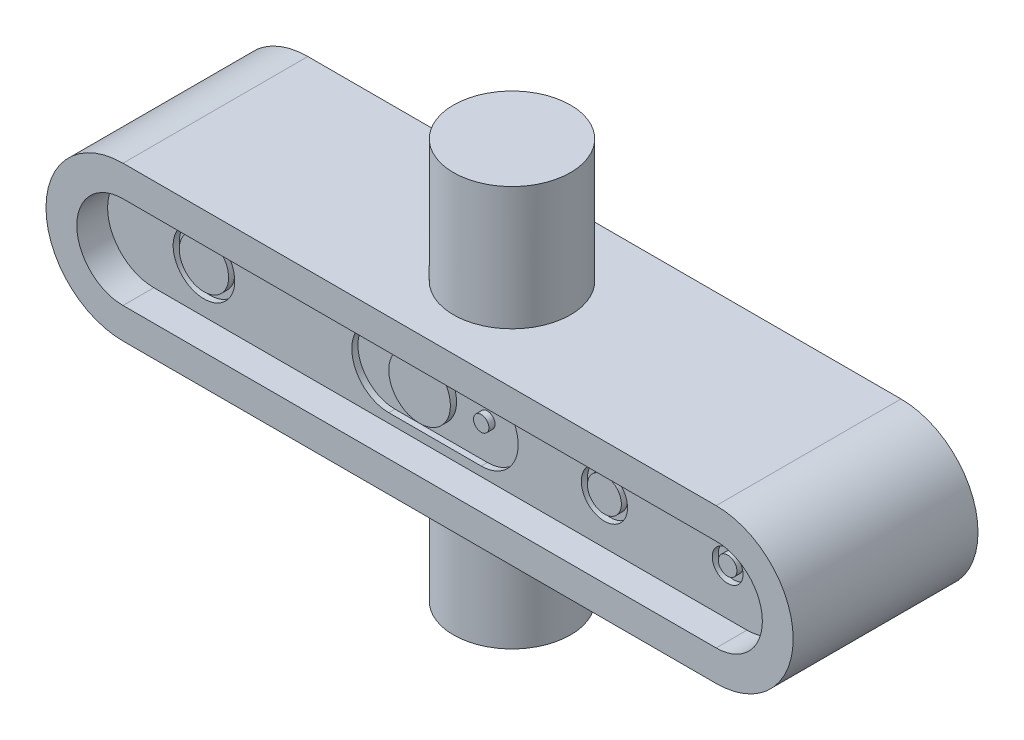
ISO-10303-21;
HEADER;
FILE_DESCRIPTION(('STEP AP214'),'2;1');
FILE_NAME('part.step','',(''),(''),'','','');
FILE_SCHEMA(('AUTOMOTIVE_DESIGN { 1 0 10303 214 1 1 1 1 }'));
ENDSEC;
DATA;
#1=APPLICATION_CONTEXT('core data for automotive mechanical design processes');
#2=APPLICATION_PROTOCOL_DEFINITION('international standard','automotive_design',2000,#1);
#3=PRODUCT_CONTEXT('',#1,'mechanical');
#4=PRODUCT('Part','Part','',(#3));
#5=PRODUCT_RELATED_PRODUCT_CATEGORY('part','',(#4));
#6=PRODUCT_DEFINITION_FORMATION('','',#4);
#7=PRODUCT_DEFINITION_CONTEXT('part definition',#1,'design');
#8=PRODUCT_DEFINITION('design','',#6,#7);
#9=PRODUCT_DEFINITION_SHAPE('','',#8);
#10=(LENGTH_UNIT() NAMED_UNIT(*) SI_UNIT(.MILLI.,.METRE.));
#11=(NAMED_UNIT(*) PLANE_ANGLE_UNIT() SI_UNIT($,.RADIAN.));
#12=(NAMED_UNIT(*) SI_UNIT($,.STERADIAN.) SOLID_ANGLE_UNIT());
#13=UNCERTAINTY_MEASURE_WITH_UNIT(LENGTH_MEASURE(1.E-05),#10,'distance_accuracy_value','');
#14=(GEOMETRIC_REPRESENTATION_CONTEXT(3) GLOBAL_UNCERTAINTY_ASSIGNED_CONTEXT((#13)) GLOBAL_UNIT_ASSIGNED_CONTEXT((#10,
#11,#12)) REPRESENTATION_CONTEXT('',''));
#15=CARTESIAN_POINT('',(0.,0.,0.));
#16=DIRECTION('',(0.,0.,1.));
#17=DIRECTION('',(1.,0.,0.));
#18=AXIS2_PLACEMENT_3D('',#15,#16,#17);
#19=CARTESIAN_POINT('',(-48.1360940201584,0.,25.));
#20=DIRECTION('',(0.,0.,-1.));
#21=DIRECTION('',(-1.,0.,0.));
#22=AXIS2_PLACEMENT_3D('',#19,#20,#21);
#23=CYLINDRICAL_SURFACE('',#22,12.5);
#24=CARTESIAN_POINT('',(-48.1360940201584,0.,0.));
#25=DIRECTION('',(0.,0.,1.));
#26=DIRECTION('',(1.,0.,0.));
#27=AXIS2_PLACEMENT_3D('',#24,#25,#26);
#28=CIRCLE('',#27,12.5);
#29=CARTESIAN_POINT('',(-48.1360940201584,12.5,0.));
#30=VERTEX_POINT('',#29);
#31=CARTESIAN_POINT('',(-48.1360940201584,-12.5,0.));
#32=VERTEX_POINT('',#31);
#33=EDGE_CURVE('E247',#30,#32,#28,.T.);
#34=ORIENTED_EDGE('',*,*,#33,.T.);
#35=DIRECTION('',(0.,0.,-1.));
#36=VECTOR('',#35,1.);
#37=CARTESIAN_POINT('',(-48.1360940201584,-12.5,25.));
#38=LINE('',#37,#36);
#39=CARTESIAN_POINT('',(-48.1360940201584,-12.5,30.));
#40=VERTEX_POINT('',#39);
#41=EDGE_CURVE('E265',#40,#32,#38,.T.);
#42=ORIENTED_EDGE('',*,*,#41,.F.);
#43=CARTESIAN_POINT('',(-48.1360940201584,0.,30.));
#44=DIRECTION('',(0.,0.,1.));
#45=DIRECTION('',(1.,0.,0.));
#46=AXIS2_PLACEMENT_3D('',#43,#44,#45);
#47=CIRCLE('',#46,12.5);
#48=CARTESIAN_POINT('',(-48.1360940201584,12.5,30.));
#49=VERTEX_POINT('',#48);
#50=EDGE_CURVE('E205',#49,#40,#47,.T.);
#51=ORIENTED_EDGE('',*,*,#50,.F.);
#52=DIRECTION('',(0.,0.,-1.));
#53=VECTOR('',#52,1.);
#54=CARTESIAN_POINT('',(-48.1360940201584,12.5,25.));
#55=LINE('',#54,#53);
#56=EDGE_CURVE('E256',#49,#30,#55,.T.);
#57=ORIENTED_EDGE('',*,*,#56,.T.);
#58=EDGE_LOOP('',(#34,#42,#51,#57));
#59=FACE_BOUND('',#58,.T.);
#60=ADVANCED_FACE('F73',(#59),#23,.T.);
#61=CARTESIAN_POINT('',(48.1360940201584,-12.5,25.));
#62=DIRECTION('',(0.,1.,0.));
#63=DIRECTION('',(0.,0.,1.));
#64=AXIS2_PLACEMENT_3D('',#61,#62,#63);
#65=PLANE('',#64);
#66=CARTESIAN_POINT('',(0.,-12.5,15.));
#67=DIRECTION('',(0.,1.,0.));
#68=DIRECTION('',(0.,0.,1.));
#69=AXIS2_PLACEMENT_3D('',#66,#67,#68);
#70=CIRCLE('',#69,9.5);
#71=CARTESIAN_POINT('',(0.,-12.5,24.5));
#72=VERTEX_POINT('',#71);
#73=EDGE_CURVE('E12',#72,#72,#70,.F.);
#74=ORIENTED_EDGE('',*,*,#73,.F.);
#75=EDGE_LOOP('',(#74));
#76=FACE_BOUND('',#75,.T.);
#77=DIRECTION('',(1.,0.,0.));
#78=VECTOR('',#77,1.);
#79=CARTESIAN_POINT('',(48.1360940201584,-12.5,0.));
#80=LINE('',#79,#78);
#81=CARTESIAN_POINT('',(48.1360940201584,-12.5,0.));
#82=VERTEX_POINT('',#81);
#83=EDGE_CURVE('E250',#32,#82,#80,.T.);
#84=ORIENTED_EDGE('',*,*,#83,.T.);
#85=DIRECTION('',(0.,0.,-1.));
#86=VECTOR('',#85,1.);
#87=CARTESIAN_POINT('',(48.1360940201584,-12.5,25.));
#88=LINE('',#87,#86);
#89=CARTESIAN_POINT('',(48.1360940201584,-12.5,30.));
#90=VERTEX_POINT('',#89);
#91=EDGE_CURVE('E262',#90,#82,#88,.T.);
#92=ORIENTED_EDGE('',*,*,#91,.F.);
#93=DIRECTION('',(1.,0.,0.));
#94=VECTOR('',#93,1.);
#95=CARTESIAN_POINT('',(-48.1360940201584,-12.5,30.));
#96=LINE('',#95,#94);
#97=EDGE_CURVE('E227',#40,#90,#96,.T.);
#98=ORIENTED_EDGE('',*,*,#97,.F.);
#99=ORIENTED_EDGE('',*,*,#41,.T.);
#100=EDGE_LOOP('',(#84,#92,#98,#99));
#101=FACE_BOUND('',#100,.T.);
#102=ADVANCED_FACE('F287',(#76,#101),#65,.F.);
#103=CARTESIAN_POINT('',(48.1360940201584,0.,25.));
#104=DIRECTION('',(0.,0.,-1.));
#105=DIRECTION('',(-1.,0.,0.));
#106=AXIS2_PLACEMENT_3D('',#103,#104,#105);
#107=CYLINDRICAL_SURFACE('',#106,12.5);
#108=CARTESIAN_POINT('',(48.1360940201584,0.,0.));
#109=DIRECTION('',(0.,0.,1.));
#110=DIRECTION('',(-1.,0.,0.));
#111=AXIS2_PLACEMENT_3D('',#108,#109,#110);
#112=CIRCLE('',#111,12.5);
#113=CARTESIAN_POINT('',(48.1360940201584,12.5,0.));
#114=VERTEX_POINT('',#113);
#115=EDGE_CURVE('E252',#82,#114,#112,.T.);
#116=ORIENTED_EDGE('',*,*,#115,.T.);
#117=DIRECTION('',(0.,0.,-1.));
#118=VECTOR('',#117,1.);
#119=CARTESIAN_POINT('',(48.1360940201584,12.5,25.));
#120=LINE('',#119,#118);
#121=CARTESIAN_POINT('',(48.1360940201584,12.5,30.));
#122=VERTEX_POINT('',#121);
#123=EDGE_CURVE('E259',#122,#114,#120,.T.);
#124=ORIENTED_EDGE('',*,*,#123,.F.);
#125=CARTESIAN_POINT('',(48.1360940201584,0.,30.));
#126=DIRECTION('',(0.,0.,1.));
#127=DIRECTION('',(1.,0.,0.));
#128=AXIS2_PLACEMENT_3D('',#125,#126,#127);
#129=CIRCLE('',#128,12.5);
#130=EDGE_CURVE('E230',#90,#122,#129,.T.);
#131=ORIENTED_EDGE('',*,*,#130,.F.);
#132=ORIENTED_EDGE('',*,*,#91,.T.);
#133=EDGE_LOOP('',(#116,#124,#131,#132));
#134=FACE_BOUND('',#133,.T.);
#135=ADVANCED_FACE('F276',(#134),#107,.T.);
#136=CARTESIAN_POINT('',(-48.1360940201584,12.5,25.));
#137=DIRECTION('',(0.,-1.,0.));
#138=DIRECTION('',(0.,0.,-1.));
#139=AXIS2_PLACEMENT_3D('',#136,#137,#138);
#140=PLANE('',#139);
#141=CARTESIAN_POINT('',(0.,12.5,15.));
#142=DIRECTION('',(0.,-1.,0.));
#143=DIRECTION('',(0.,0.,-1.));
#144=AXIS2_PLACEMENT_3D('',#141,#142,#143);
#145=CIRCLE('',#144,9.5);
#146=CARTESIAN_POINT('',(0.,12.5,5.50000000000001));
#147=VERTEX_POINT('',#146);
#148=EDGE_CURVE('E80',#147,#147,#145,.F.);
#149=ORIENTED_EDGE('',*,*,#148,.F.);
#150=EDGE_LOOP('',(#149));
#151=FACE_BOUND('',#150,.T.);
#152=DIRECTION('',(-1.,0.,0.));
#153=VECTOR('',#152,1.);
#154=CARTESIAN_POINT('',(-48.1360940201584,12.5,0.));
#155=LINE('',#154,#153);
#156=EDGE_CURVE('E254',#114,#30,#155,.T.);
#157=ORIENTED_EDGE('',*,*,#156,.T.);
#158=ORIENTED_EDGE('',*,*,#56,.F.);
#159=DIRECTION('',(-1.,0.,0.));
#160=VECTOR('',#159,1.);
#161=CARTESIAN_POINT('',(-48.1360940201584,12.5,30.));
#162=LINE('',#161,#160);
#163=EDGE_CURVE('E214',#122,#49,#162,.T.);
#164=ORIENTED_EDGE('',*,*,#163,.F.);
#165=ORIENTED_EDGE('',*,*,#123,.T.);
#166=EDGE_LOOP('',(#157,#158,#164,#165));
#167=FACE_BOUND('',#166,.T.);
#168=ADVANCED_FACE('F272',(#151,#167),#140,.F.);
#169=CARTESIAN_POINT('',(-48.1360940201584,0.,0.));
#170=DIRECTION('',(0.,0.,1.));
#171=DIRECTION('',(1.,0.,0.));
#172=AXIS2_PLACEMENT_3D('',#169,#170,#171);
#173=PLANE('',#172);
#174=ORIENTED_EDGE('',*,*,#33,.F.);
#175=ORIENTED_EDGE('',*,*,#156,.F.);
#176=ORIENTED_EDGE('',*,*,#115,.F.);
#177=ORIENTED_EDGE('',*,*,#83,.F.);
#178=EDGE_LOOP('',(#174,#175,#176,#177));
#179=FACE_BOUND('',#178,.T.);
#180=ADVANCED_FACE('F275',(#179),#173,.F.);
#181=CARTESIAN_POINT('',(-48.1360940201584,7.5,30.));
#182=DIRECTION('',(0.,-1.,0.));
#183=DIRECTION('',(0.,0.,-1.));
#184=AXIS2_PLACEMENT_3D('',#181,#182,#183);
#185=PLANE('',#184);
#186=DIRECTION('',(1.,0.,0.));
#187=VECTOR('',#186,1.);
#188=CARTESIAN_POINT('',(-48.1360940201584,7.5,25.));
#189=LINE('',#188,#187);
#190=CARTESIAN_POINT('',(48.1360940201584,7.5,25.));
#191=VERTEX_POINT('',#190);
#192=CARTESIAN_POINT('',(-48.1360940201584,7.5,25.));
#193=VERTEX_POINT('',#192);
#194=EDGE_CURVE('E211',#191,#193,#189,.F.);
#195=ORIENTED_EDGE('',*,*,#194,.F.);
#196=DIRECTION('',(0.,0.,-1.));
#197=VECTOR('',#196,1.);
#198=CARTESIAN_POINT('',(48.1360940201584,7.5,30.));
#199=LINE('',#198,#197);
#200=CARTESIAN_POINT('',(48.1360940201584,7.5,30.));
#201=VERTEX_POINT('',#200);
#202=EDGE_CURVE('E242',#201,#191,#199,.T.);
#203=ORIENTED_EDGE('',*,*,#202,.F.);
#204=DIRECTION('',(1.,0.,0.));
#205=VECTOR('',#204,1.);
#206=CARTESIAN_POINT('',(-48.1360940201584,7.5,30.));
#207=LINE('',#206,#205);
#208=CARTESIAN_POINT('',(-48.1360940201584,7.5,30.));
#209=VERTEX_POINT('',#208);
#210=EDGE_CURVE('E217',#201,#209,#207,.F.);
#211=ORIENTED_EDGE('',*,*,#210,.T.);
#212=DIRECTION('',(0.,0.,-1.));
#213=VECTOR('',#212,1.);
#214=CARTESIAN_POINT('',(-48.1360940201584,7.5,30.));
#215=LINE('',#214,#213);
#216=EDGE_CURVE('E244',#209,#193,#215,.T.);
#217=ORIENTED_EDGE('',*,*,#216,.T.);
#218=EDGE_LOOP('',(#195,#203,#211,#217));
#219=FACE_BOUND('',#218,.T.);
#220=ADVANCED_FACE('F438',(#219),#185,.T.);
#221=CARTESIAN_POINT('',(48.1360940201584,0.,30.));
#222=DIRECTION('',(0.,0.,-1.));
#223=DIRECTION('',(-1.,0.,0.));
#224=AXIS2_PLACEMENT_3D('',#221,#222,#223);
#225=CYLINDRICAL_SURFACE('',#224,7.5);
#226=CARTESIAN_POINT('',(48.1360940201584,0.,25.));
#227=DIRECTION('',(0.,0.,1.));
#228=DIRECTION('',(1.,0.,0.));
#229=AXIS2_PLACEMENT_3D('',#226,#227,#228);
#230=CIRCLE('',#229,7.5);
#231=CARTESIAN_POINT('',(48.1360940201584,-7.5,25.));
#232=VERTEX_POINT('',#231);
#233=EDGE_CURVE('E95',#232,#191,#230,.T.);
#234=ORIENTED_EDGE('',*,*,#233,.F.);
#235=DIRECTION('',(0.,0.,-1.));
#236=VECTOR('',#235,1.);
#237=CARTESIAN_POINT('',(48.1360940201584,-7.5,30.));
#238=LINE('',#237,#236);
#239=CARTESIAN_POINT('',(48.1360940201584,-7.5,30.));
#240=VERTEX_POINT('',#239);
#241=EDGE_CURVE('E239',#240,#232,#238,.T.);
#242=ORIENTED_EDGE('',*,*,#241,.F.);
#243=CARTESIAN_POINT('',(48.1360940201584,0.,30.));
#244=DIRECTION('',(0.,0.,1.));
#245=DIRECTION('',(1.,0.,0.));
#246=AXIS2_PLACEMENT_3D('',#243,#244,#245);
#247=CIRCLE('',#246,7.5);
#248=EDGE_CURVE('E221',#240,#201,#247,.T.);
#249=ORIENTED_EDGE('',*,*,#248,.T.);
#250=ORIENTED_EDGE('',*,*,#202,.T.);
#251=EDGE_LOOP('',(#234,#242,#249,#250));
#252=FACE_BOUND('',#251,.T.);
#253=ADVANCED_FACE('F434',(#252),#225,.F.);
#254=CARTESIAN_POINT('',(-48.1360940201584,-7.5,30.));
#255=DIRECTION('',(0.,1.,0.));
#256=DIRECTION('',(0.,0.,1.));
#257=AXIS2_PLACEMENT_3D('',#254,#255,#256);
#258=PLANE('',#257);
#259=DIRECTION('',(1.,0.,0.));
#260=VECTOR('',#259,1.);
#261=CARTESIAN_POINT('',(-48.1360940201584,-7.5,25.));
#262=LINE('',#261,#260);
#263=CARTESIAN_POINT('',(-48.1360940201584,-7.5,25.));
#264=VERTEX_POINT('',#263);
#265=EDGE_CURVE('E218',#264,#232,#262,.T.);
#266=ORIENTED_EDGE('',*,*,#265,.F.);
#267=DIRECTION('',(0.,0.,-1.));
#268=VECTOR('',#267,1.);
#269=CARTESIAN_POINT('',(-48.1360940201584,-7.5,30.));
#270=LINE('',#269,#268);
#271=CARTESIAN_POINT('',(-48.1360940201584,-7.5,30.));
#272=VERTEX_POINT('',#271);
#273=EDGE_CURVE('E233',#272,#264,#270,.T.);
#274=ORIENTED_EDGE('',*,*,#273,.F.);
#275=DIRECTION('',(1.,0.,0.));
#276=VECTOR('',#275,1.);
#277=CARTESIAN_POINT('',(-48.1360940201584,-7.5,30.));
#278=LINE('',#277,#276);
#279=EDGE_CURVE('E224',#272,#240,#278,.T.);
#280=ORIENTED_EDGE('',*,*,#279,.T.);
#281=ORIENTED_EDGE('',*,*,#241,.T.);
#282=EDGE_LOOP('',(#266,#274,#280,#281));
#283=FACE_BOUND('',#282,.T.);
#284=ADVANCED_FACE('F430',(#283),#258,.T.);
#285=CARTESIAN_POINT('',(48.1360940201584,0.,30.));
#286=DIRECTION('',(0.,0.,1.));
#287=DIRECTION('',(1.,0.,0.));
#288=AXIS2_PLACEMENT_3D('',#285,#286,#287);
#289=PLANE('',#288);
#290=ORIENTED_EDGE('',*,*,#279,.F.);
#291=CARTESIAN_POINT('',(-48.1360940201584,0.,30.));
#292=DIRECTION('',(0.,0.,1.));
#293=DIRECTION('',(1.,0.,0.));
#294=AXIS2_PLACEMENT_3D('',#291,#292,#293);
#295=CIRCLE('',#294,7.5);
#296=EDGE_CURVE('E208',#209,#272,#295,.T.);
#297=ORIENTED_EDGE('',*,*,#296,.F.);
#298=ORIENTED_EDGE('',*,*,#210,.F.);
#299=ORIENTED_EDGE('',*,*,#248,.F.);
#300=EDGE_LOOP('',(#290,#297,#298,#299));
#301=FACE_BOUND('',#300,.T.);
#302=ORIENTED_EDGE('',*,*,#163,.T.);
#303=ORIENTED_EDGE('',*,*,#50,.T.);
#304=ORIENTED_EDGE('',*,*,#97,.T.);
#305=ORIENTED_EDGE('',*,*,#130,.T.);
#306=EDGE_LOOP('',(#302,#303,#304,#305));
#307=FACE_BOUND('',#306,.T.);
#308=ADVANCED_FACE('F289',(#301,#307),#289,.T.);
#309=CARTESIAN_POINT('',(-48.1360940201584,0.,30.));
#310=DIRECTION('',(0.,0.,-1.));
#311=DIRECTION('',(-1.,0.,0.));
#312=AXIS2_PLACEMENT_3D('',#309,#310,#311);
#313=CYLINDRICAL_SURFACE('',#312,7.5);
#314=CARTESIAN_POINT('',(-48.1360940201584,0.,25.));
#315=DIRECTION('',(0.,0.,1.));
#316=DIRECTION('',(1.,0.,0.));
#317=AXIS2_PLACEMENT_3D('',#314,#315,#316);
#318=CIRCLE('',#317,7.5);
#319=EDGE_CURVE('E209',#193,#264,#318,.T.);
#320=ORIENTED_EDGE('',*,*,#319,.F.);
#321=ORIENTED_EDGE('',*,*,#216,.F.);
#322=ORIENTED_EDGE('',*,*,#296,.T.);
#323=ORIENTED_EDGE('',*,*,#273,.T.);
#324=EDGE_LOOP('',(#320,#321,#322,#323));
#325=FACE_BOUND('',#324,.T.);
#326=ADVANCED_FACE('F424',(#325),#313,.F.);
#327=CARTESIAN_POINT('',(-48.1360940201584,0.,25.));
#328=DIRECTION('',(0.,0.,1.));
#329=DIRECTION('',(1.,0.,0.));
#330=AXIS2_PLACEMENT_3D('',#327,#328,#329);
#331=PLANE('',#330);
#332=CARTESIAN_POINT('',(-10.,0.,25.));
#333=DIRECTION('',(0.,0.,1.));
#334=DIRECTION('',(1.,0.,0.));
#335=AXIS2_PLACEMENT_3D('',#332,#333,#334);
#336=CIRCLE('',#335,6.);
#337=CARTESIAN_POINT('',(-10.,6.,25.));
#338=VERTEX_POINT('',#337);
#339=CARTESIAN_POINT('',(-10.,-6.,25.));
#340=VERTEX_POINT('',#339);
#341=EDGE_CURVE('E168',#338,#340,#336,.T.);
#342=ORIENTED_EDGE('',*,*,#341,.F.);
#343=DIRECTION('',(-1.,0.,0.));
#344=VECTOR('',#343,1.);
#345=CARTESIAN_POINT('',(-10.,6.,25.));
#346=LINE('',#345,#344);
#347=CARTESIAN_POINT('',(5.,6.,25.));
#348=VERTEX_POINT('',#347);
#349=EDGE_CURVE('E185',#348,#338,#346,.T.);
#350=ORIENTED_EDGE('',*,*,#349,.F.);
#351=CARTESIAN_POINT('',(5.,0.,25.));
#352=DIRECTION('',(0.,0.,1.));
#353=DIRECTION('',(1.,0.,0.));
#354=AXIS2_PLACEMENT_3D('',#351,#352,#353);
#355=CIRCLE('',#354,6.);
#356=CARTESIAN_POINT('',(5.,-6.,25.));
#357=VERTEX_POINT('',#356);
#358=EDGE_CURVE('E87',#357,#348,#355,.T.);
#359=ORIENTED_EDGE('',*,*,#358,.F.);
#360=DIRECTION('',(1.,0.,0.));
#361=VECTOR('',#360,1.);
#362=CARTESIAN_POINT('',(5.,-6.,25.));
#363=LINE('',#362,#361);
#364=EDGE_CURVE('E196',#340,#357,#363,.T.);
#365=ORIENTED_EDGE('',*,*,#364,.F.);
#366=EDGE_LOOP('',(#342,#350,#359,#365));
#367=FACE_BOUND('',#366,.T.);
#368=CARTESIAN_POINT('',(-40.,0.,25.));
#369=DIRECTION('',(0.,0.,1.));
#370=DIRECTION('',(1.,0.,0.));
#371=AXIS2_PLACEMENT_3D('',#368,#369,#370);
#372=CIRCLE('',#371,5.);
#373=CARTESIAN_POINT('',(-35.,0.,25.));
#374=VERTEX_POINT('',#373);
#375=EDGE_CURVE('E667',#374,#374,#372,.T.);
#376=ORIENTED_EDGE('',*,*,#375,.F.);
#377=EDGE_LOOP('',(#376));
#378=FACE_BOUND('',#377,.T.);
#379=CARTESIAN_POINT('',(25.,0.,25.));
#380=DIRECTION('',(0.,0.,1.));
#381=DIRECTION('',(1.,0.,0.));
#382=AXIS2_PLACEMENT_3D('',#379,#380,#381);
#383=CIRCLE('',#382,3.75);
#384=CARTESIAN_POINT('',(28.75,0.,25.));
#385=VERTEX_POINT('',#384);
#386=EDGE_CURVE('E671',#385,#385,#383,.T.);
#387=ORIENTED_EDGE('',*,*,#386,.F.);
#388=EDGE_LOOP('',(#387));
#389=FACE_BOUND('',#388,.T.);
#390=CARTESIAN_POINT('',(45.,0.,25.));
#391=DIRECTION('',(0.,0.,1.));
#392=DIRECTION('',(1.,0.,0.));
#393=AXIS2_PLACEMENT_3D('',#390,#391,#392);
#394=CIRCLE('',#393,2.5);
#395=CARTESIAN_POINT('',(47.5,0.,25.));
#396=VERTEX_POINT('',#395);
#397=EDGE_CURVE('E190',#396,#396,#394,.T.);
#398=ORIENTED_EDGE('',*,*,#397,.F.);
#399=EDGE_LOOP('',(#398));
#400=FACE_BOUND('',#399,.T.);
#401=ORIENTED_EDGE('',*,*,#194,.T.);
#402=ORIENTED_EDGE('',*,*,#319,.T.);
#403=ORIENTED_EDGE('',*,*,#265,.T.);
#404=ORIENTED_EDGE('',*,*,#233,.T.);
#405=EDGE_LOOP('',(#401,#402,#403,#404));
#406=FACE_BOUND('',#405,.T.);
#407=ADVANCED_FACE('F408',(#367,#378,#389,#400,#406),#331,.T.);
#408=CARTESIAN_POINT('',(45.,0.,24.));
#409=DIRECTION('',(0.,0.,1.));
#410=DIRECTION('',(1.,0.,0.));
#411=AXIS2_PLACEMENT_3D('',#408,#409,#410);
#412=CYLINDRICAL_SURFACE('',#411,2.5);
#413=CARTESIAN_POINT('',(45.,0.,24.));
#414=DIRECTION('',(0.,0.,1.));
#415=DIRECTION('',(1.,0.,0.));
#416=AXIS2_PLACEMENT_3D('',#413,#414,#415);
#417=CIRCLE('',#416,2.5);
#418=CARTESIAN_POINT('',(47.5,0.,24.));
#419=VERTEX_POINT('',#418);
#420=EDGE_CURVE('E683',#419,#419,#417,.T.);
#421=ORIENTED_EDGE('',*,*,#420,.F.);
#422=EDGE_LOOP('',(#421));
#423=FACE_BOUND('',#422,.T.);
#424=ORIENTED_EDGE('',*,*,#397,.T.);
#425=EDGE_LOOP('',(#424));
#426=FACE_BOUND('',#425,.T.);
#427=ADVANCED_FACE('F404',(#423,#426),#412,.F.);
#428=CARTESIAN_POINT('',(45.,0.,24.));
#429=DIRECTION('',(0.,0.,1.));
#430=DIRECTION('',(1.,0.,0.));
#431=AXIS2_PLACEMENT_3D('',#428,#429,#430);
#432=PLANE('',#431);
#433=CARTESIAN_POINT('',(45.,0.,24.));
#434=DIRECTION('',(0.,0.,1.));
#435=DIRECTION('',(1.,0.,0.));
#436=AXIS2_PLACEMENT_3D('',#433,#434,#435);
#437=CIRCLE('',#436,1.5);
#438=CARTESIAN_POINT('',(46.5,0.,24.));
#439=VERTEX_POINT('',#438);
#440=EDGE_CURVE('E719',#439,#439,#437,.T.);
#441=ORIENTED_EDGE('',*,*,#440,.F.);
#442=EDGE_LOOP('',(#441));
#443=FACE_BOUND('',#442,.T.);
#444=ORIENTED_EDGE('',*,*,#420,.T.);
#445=EDGE_LOOP('',(#444));
#446=FACE_BOUND('',#445,.T.);
#447=ADVANCED_FACE('F400',(#443,#446),#432,.T.);
#448=CARTESIAN_POINT('',(25.,0.,24.));
#449=DIRECTION('',(0.,0.,1.));
#450=DIRECTION('',(1.,0.,0.));
#451=AXIS2_PLACEMENT_3D('',#448,#449,#450);
#452=CYLINDRICAL_SURFACE('',#451,3.75);
#453=CARTESIAN_POINT('',(25.,0.,24.));
#454=DIRECTION('',(0.,0.,1.));
#455=DIRECTION('',(1.,0.,0.));
#456=AXIS2_PLACEMENT_3D('',#453,#454,#455);
#457=CIRCLE('',#456,3.75);
#458=CARTESIAN_POINT('',(28.75,0.,24.));
#459=VERTEX_POINT('',#458);
#460=EDGE_CURVE('E197',#459,#459,#457,.T.);
#461=ORIENTED_EDGE('',*,*,#460,.F.);
#462=EDGE_LOOP('',(#461));
#463=FACE_BOUND('',#462,.T.);
#464=ORIENTED_EDGE('',*,*,#386,.T.);
#465=EDGE_LOOP('',(#464));
#466=FACE_BOUND('',#465,.T.);
#467=ADVANCED_FACE('F396',(#463,#466),#452,.F.);
#468=CARTESIAN_POINT('',(25.,0.,24.));
#469=DIRECTION('',(0.,0.,1.));
#470=DIRECTION('',(1.,0.,0.));
#471=AXIS2_PLACEMENT_3D('',#468,#469,#470);
#472=PLANE('',#471);
#473=CARTESIAN_POINT('',(25.,0.,24.));
#474=DIRECTION('',(0.,0.,1.));
#475=DIRECTION('',(1.,0.,0.));
#476=AXIS2_PLACEMENT_3D('',#473,#474,#475);
#477=CIRCLE('',#476,2.75);
#478=CARTESIAN_POINT('',(27.75,0.,24.));
#479=VERTEX_POINT('',#478);
#480=EDGE_CURVE('E713',#479,#479,#477,.T.);
#481=ORIENTED_EDGE('',*,*,#480,.F.);
#482=EDGE_LOOP('',(#481));
#483=FACE_BOUND('',#482,.T.);
#484=ORIENTED_EDGE('',*,*,#460,.T.);
#485=EDGE_LOOP('',(#484));
#486=FACE_BOUND('',#485,.T.);
#487=ADVANCED_FACE('F392',(#483,#486),#472,.T.);
#488=CARTESIAN_POINT('',(-40.,0.,24.));
#489=DIRECTION('',(0.,0.,1.));
#490=DIRECTION('',(1.,0.,0.));
#491=AXIS2_PLACEMENT_3D('',#488,#489,#490);
#492=CYLINDRICAL_SURFACE('',#491,5.);
#493=CARTESIAN_POINT('',(-40.,0.,24.));
#494=DIRECTION('',(0.,0.,1.));
#495=DIRECTION('',(1.,0.,0.));
#496=AXIS2_PLACEMENT_3D('',#493,#494,#495);
#497=CIRCLE('',#496,5.);
#498=CARTESIAN_POINT('',(-35.,0.,24.));
#499=VERTEX_POINT('',#498);
#500=EDGE_CURVE('E213',#499,#499,#497,.T.);
#501=ORIENTED_EDGE('',*,*,#500,.F.);
#502=EDGE_LOOP('',(#501));
#503=FACE_BOUND('',#502,.T.);
#504=ORIENTED_EDGE('',*,*,#375,.T.);
#505=EDGE_LOOP('',(#504));
#506=FACE_BOUND('',#505,.T.);
#507=ADVANCED_FACE('F388',(#503,#506),#492,.F.);
#508=CARTESIAN_POINT('',(-40.,0.,24.));
#509=DIRECTION('',(0.,0.,1.));
#510=DIRECTION('',(1.,0.,0.));
#511=AXIS2_PLACEMENT_3D('',#508,#509,#510);
#512=PLANE('',#511);
#513=CARTESIAN_POINT('',(-40.,0.,24.));
#514=DIRECTION('',(0.,0.,1.));
#515=DIRECTION('',(1.,0.,0.));
#516=AXIS2_PLACEMENT_3D('',#513,#514,#515);
#517=CIRCLE('',#516,4.);
#518=CARTESIAN_POINT('',(-36.,0.,24.));
#519=VERTEX_POINT('',#518);
#520=EDGE_CURVE('E707',#519,#519,#517,.T.);
#521=ORIENTED_EDGE('',*,*,#520,.F.);
#522=EDGE_LOOP('',(#521));
#523=FACE_BOUND('',#522,.T.);
#524=ORIENTED_EDGE('',*,*,#500,.T.);
#525=EDGE_LOOP('',(#524));
#526=FACE_BOUND('',#525,.T.);
#527=ADVANCED_FACE('F385',(#523,#526),#512,.T.);
#528=CARTESIAN_POINT('',(-10.,0.,24.));
#529=DIRECTION('',(0.,0.,1.));
#530=DIRECTION('',(1.,0.,0.));
#531=AXIS2_PLACEMENT_3D('',#528,#529,#530);
#532=CYLINDRICAL_SURFACE('',#531,6.);
#533=ORIENTED_EDGE('',*,*,#341,.T.);
#534=DIRECTION('',(0.,0.,1.));
#535=VECTOR('',#534,1.);
#536=CARTESIAN_POINT('',(-10.,-6.,24.));
#537=LINE('',#536,#535);
#538=CARTESIAN_POINT('',(-10.,-6.,24.));
#539=VERTEX_POINT('',#538);
#540=EDGE_CURVE('E161',#539,#340,#537,.T.);
#541=ORIENTED_EDGE('',*,*,#540,.F.);
#542=CARTESIAN_POINT('',(-10.,0.,24.));
#543=DIRECTION('',(0.,0.,1.));
#544=DIRECTION('',(1.,0.,0.));
#545=AXIS2_PLACEMENT_3D('',#542,#543,#544);
#546=CIRCLE('',#545,6.);
#547=CARTESIAN_POINT('',(-10.,6.,24.));
#548=VERTEX_POINT('',#547);
#549=EDGE_CURVE('E165',#548,#539,#546,.T.);
#550=ORIENTED_EDGE('',*,*,#549,.F.);
#551=DIRECTION('',(0.,0.,1.));
#552=VECTOR('',#551,1.);
#553=CARTESIAN_POINT('',(-10.,6.,24.));
#554=LINE('',#553,#552);
#555=EDGE_CURVE('E200',#548,#338,#554,.T.);
#556=ORIENTED_EDGE('',*,*,#555,.T.);
#557=EDGE_LOOP('',(#533,#541,#550,#556));
#558=FACE_BOUND('',#557,.T.);
#559=ADVANCED_FACE('F163',(#558),#532,.F.);
#560=CARTESIAN_POINT('',(-10.,6.,24.));
#561=DIRECTION('',(0.,1.,0.));
#562=DIRECTION('',(0.,0.,1.));
#563=AXIS2_PLACEMENT_3D('',#560,#561,#562);
#564=PLANE('',#563);
#565=ORIENTED_EDGE('',*,*,#349,.T.);
#566=ORIENTED_EDGE('',*,*,#555,.F.);
#567=DIRECTION('',(-1.,0.,0.));
#568=VECTOR('',#567,1.);
#569=CARTESIAN_POINT('',(-10.,6.,24.));
#570=LINE('',#569,#568);
#571=CARTESIAN_POINT('',(5.,6.,24.));
#572=VERTEX_POINT('',#571);
#573=EDGE_CURVE('E173',#572,#548,#570,.T.);
#574=ORIENTED_EDGE('',*,*,#573,.F.);
#575=DIRECTION('',(0.,0.,1.));
#576=VECTOR('',#575,1.);
#577=CARTESIAN_POINT('',(5.,6.,24.));
#578=LINE('',#577,#576);
#579=EDGE_CURVE('E202',#572,#348,#578,.T.);
#580=ORIENTED_EDGE('',*,*,#579,.T.);
#581=EDGE_LOOP('',(#565,#566,#574,#580));
#582=FACE_BOUND('',#581,.T.);
#583=ADVANCED_FACE('F413',(#582),#564,.F.);
#584=CARTESIAN_POINT('',(5.,0.,24.));
#585=DIRECTION('',(0.,0.,1.));
#586=DIRECTION('',(1.,0.,0.));
#587=AXIS2_PLACEMENT_3D('',#584,#585,#586);
#588=CYLINDRICAL_SURFACE('',#587,6.);
#589=ORIENTED_EDGE('',*,*,#358,.T.);
#590=ORIENTED_EDGE('',*,*,#579,.F.);
#591=CARTESIAN_POINT('',(5.,0.,24.));
#592=DIRECTION('',(0.,0.,1.));
#593=DIRECTION('',(1.,0.,0.));
#594=AXIS2_PLACEMENT_3D('',#591,#592,#593);
#595=CIRCLE('',#594,6.);
#596=CARTESIAN_POINT('',(5.,-6.,24.));
#597=VERTEX_POINT('',#596);
#598=EDGE_CURVE('E181',#597,#572,#595,.T.);
#599=ORIENTED_EDGE('',*,*,#598,.F.);
#600=DIRECTION('',(0.,0.,1.));
#601=VECTOR('',#600,1.);
#602=CARTESIAN_POINT('',(5.,-6.,24.));
#603=LINE('',#602,#601);
#604=EDGE_CURVE('E172',#597,#357,#603,.T.);
#605=ORIENTED_EDGE('',*,*,#604,.T.);
#606=EDGE_LOOP('',(#589,#590,#599,#605));
#607=FACE_BOUND('',#606,.T.);
#608=ADVANCED_FACE('F416',(#607),#588,.F.);
#609=CARTESIAN_POINT('',(5.,-6.,24.));
#610=DIRECTION('',(0.,-1.,0.));
#611=DIRECTION('',(1.,0.,0.));
#612=AXIS2_PLACEMENT_3D('',#609,#610,#611);
#613=PLANE('',#612);
#614=ORIENTED_EDGE('',*,*,#364,.T.);
#615=ORIENTED_EDGE('',*,*,#604,.F.);
#616=DIRECTION('',(1.,0.,0.));
#617=VECTOR('',#616,1.);
#618=CARTESIAN_POINT('',(5.,-6.,24.));
#619=LINE('',#618,#617);
#620=EDGE_CURVE('E176',#539,#597,#619,.T.);
#621=ORIENTED_EDGE('',*,*,#620,.F.);
#622=ORIENTED_EDGE('',*,*,#540,.T.);
#623=EDGE_LOOP('',(#614,#615,#621,#622));
#624=FACE_BOUND('',#623,.T.);
#625=ADVANCED_FACE('F177',(#624),#613,.F.);
#626=CARTESIAN_POINT('',(-10.,0.,24.));
#627=DIRECTION('',(0.,0.,1.));
#628=DIRECTION('',(1.,0.,0.));
#629=AXIS2_PLACEMENT_3D('',#626,#627,#628);
#630=PLANE('',#629);
#631=CARTESIAN_POINT('',(5.,0.,24.));
#632=DIRECTION('',(0.,0.,1.));
#633=DIRECTION('',(1.,0.,0.));
#634=AXIS2_PLACEMENT_3D('',#631,#632,#633);
#635=CIRCLE('',#634,1.25);
#636=CARTESIAN_POINT('',(6.25,0.,24.));
#637=VERTEX_POINT('',#636);
#638=EDGE_CURVE('E701',#637,#637,#635,.T.);
#639=ORIENTED_EDGE('',*,*,#638,.F.);
#640=EDGE_LOOP('',(#639));
#641=FACE_BOUND('',#640,.T.);
#642=CARTESIAN_POINT('',(-5.,0.,24.));
#643=DIRECTION('',(0.,0.,1.));
#644=DIRECTION('',(1.,0.,0.));
#645=AXIS2_PLACEMENT_3D('',#642,#643,#644);
#646=CIRCLE('',#645,5.);
#647=CARTESIAN_POINT('',(0.,0.,24.));
#648=VERTEX_POINT('',#647);
#649=EDGE_CURVE('E695',#648,#648,#646,.T.);
#650=ORIENTED_EDGE('',*,*,#649,.F.);
#651=EDGE_LOOP('',(#650));
#652=FACE_BOUND('',#651,.T.);
#653=ORIENTED_EDGE('',*,*,#549,.T.);
#654=ORIENTED_EDGE('',*,*,#620,.T.);
#655=ORIENTED_EDGE('',*,*,#598,.T.);
#656=ORIENTED_EDGE('',*,*,#573,.T.);
#657=EDGE_LOOP('',(#653,#654,#655,#656));
#658=FACE_BOUND('',#657,.T.);
#659=ADVANCED_FACE('F183',(#641,#652,#658),#630,.T.);
#660=CARTESIAN_POINT('',(-5.,0.,25.));
#661=DIRECTION('',(0.,0.,-1.));
#662=DIRECTION('',(-1.,0.,0.));
#663=AXIS2_PLACEMENT_3D('',#660,#661,#662);
#664=CYLINDRICAL_SURFACE('',#663,5.);
#665=CARTESIAN_POINT('',(-5.,0.,25.));
#666=DIRECTION('',(0.,0.,1.));
#667=DIRECTION('',(1.,0.,0.));
#668=AXIS2_PLACEMENT_3D('',#665,#666,#667);
#669=CIRCLE('',#668,5.);
#670=CARTESIAN_POINT('',(0.,0.,25.));
#671=VERTEX_POINT('',#670);
#672=EDGE_CURVE('E690',#671,#671,#669,.T.);
#673=ORIENTED_EDGE('',*,*,#672,.F.);
#674=EDGE_LOOP('',(#673));
#675=FACE_BOUND('',#674,.T.);
#676=ORIENTED_EDGE('',*,*,#649,.T.);
#677=EDGE_LOOP('',(#676));
#678=FACE_BOUND('',#677,.T.);
#679=ADVANCED_FACE('F380',(#675,#678),#664,.T.);
#680=CARTESIAN_POINT('',(-5.,0.,25.));
#681=DIRECTION('',(0.,0.,1.));
#682=DIRECTION('',(1.,0.,0.));
#683=AXIS2_PLACEMENT_3D('',#680,#681,#682);
#684=PLANE('',#683);
#685=ORIENTED_EDGE('',*,*,#672,.T.);
#686=EDGE_LOOP('',(#685));
#687=FACE_BOUND('',#686,.T.);
#688=ADVANCED_FACE('F376',(#687),#684,.T.);
#689=CARTESIAN_POINT('',(5.,0.,25.));
#690=DIRECTION('',(0.,0.,-1.));
#691=DIRECTION('',(-1.,0.,0.));
#692=AXIS2_PLACEMENT_3D('',#689,#690,#691);
#693=CYLINDRICAL_SURFACE('',#692,1.25);
#694=CARTESIAN_POINT('',(5.,0.,25.));
#695=DIRECTION('',(0.,0.,1.));
#696=DIRECTION('',(1.,0.,0.));
#697=AXIS2_PLACEMENT_3D('',#694,#695,#696);
#698=CIRCLE('',#697,1.25);
#699=CARTESIAN_POINT('',(6.25,0.,25.));
#700=VERTEX_POINT('',#699);
#701=EDGE_CURVE('E698',#700,#700,#698,.T.);
#702=ORIENTED_EDGE('',*,*,#701,.F.);
#703=EDGE_LOOP('',(#702));
#704=FACE_BOUND('',#703,.T.);
#705=ORIENTED_EDGE('',*,*,#638,.T.);
#706=EDGE_LOOP('',(#705));
#707=FACE_BOUND('',#706,.T.);
#708=ADVANCED_FACE('F372',(#704,#707),#693,.T.);
#709=CARTESIAN_POINT('',(5.,0.,25.));
#710=DIRECTION('',(0.,0.,1.));
#711=DIRECTION('',(1.,0.,0.));
#712=AXIS2_PLACEMENT_3D('',#709,#710,#711);
#713=PLANE('',#712);
#714=ORIENTED_EDGE('',*,*,#701,.T.);
#715=EDGE_LOOP('',(#714));
#716=FACE_BOUND('',#715,.T.);
#717=ADVANCED_FACE('F368',(#716),#713,.T.);
#718=CARTESIAN_POINT('',(-40.,0.,25.));
#719=DIRECTION('',(0.,0.,-1.));
#720=DIRECTION('',(-1.,0.,0.));
#721=AXIS2_PLACEMENT_3D('',#718,#719,#720);
#722=CYLINDRICAL_SURFACE('',#721,4.);
#723=CARTESIAN_POINT('',(-40.,0.,25.));
#724=DIRECTION('',(0.,0.,1.));
#725=DIRECTION('',(1.,0.,0.));
#726=AXIS2_PLACEMENT_3D('',#723,#724,#725);
#727=CIRCLE('',#726,4.);
#728=CARTESIAN_POINT('',(-36.,0.,25.));
#729=VERTEX_POINT('',#728);
#730=EDGE_CURVE('E704',#729,#729,#727,.T.);
#731=ORIENTED_EDGE('',*,*,#730,.F.);
#732=EDGE_LOOP('',(#731));
#733=FACE_BOUND('',#732,.T.);
#734=ORIENTED_EDGE('',*,*,#520,.T.);
#735=EDGE_LOOP('',(#734));
#736=FACE_BOUND('',#735,.T.);
#737=ADVANCED_FACE('F364',(#733,#736),#722,.T.);
#738=CARTESIAN_POINT('',(-40.,0.,25.));
#739=DIRECTION('',(0.,0.,1.));
#740=DIRECTION('',(1.,0.,0.));
#741=AXIS2_PLACEMENT_3D('',#738,#739,#740);
#742=PLANE('',#741);
#743=ORIENTED_EDGE('',*,*,#730,.T.);
#744=EDGE_LOOP('',(#743));
#745=FACE_BOUND('',#744,.T.);
#746=ADVANCED_FACE('F360',(#745),#742,.T.);
#747=CARTESIAN_POINT('',(25.,0.,25.));
#748=DIRECTION('',(0.,0.,-1.));
#749=DIRECTION('',(-1.,0.,0.));
#750=AXIS2_PLACEMENT_3D('',#747,#748,#749);
#751=CYLINDRICAL_SURFACE('',#750,2.75);
#752=CARTESIAN_POINT('',(25.,0.,25.));
#753=DIRECTION('',(0.,0.,1.));
#754=DIRECTION('',(1.,0.,0.));
#755=AXIS2_PLACEMENT_3D('',#752,#753,#754);
#756=CIRCLE('',#755,2.75);
#757=CARTESIAN_POINT('',(27.75,0.,25.));
#758=VERTEX_POINT('',#757);
#759=EDGE_CURVE('E710',#758,#758,#756,.T.);
#760=ORIENTED_EDGE('',*,*,#759,.F.);
#761=EDGE_LOOP('',(#760));
#762=FACE_BOUND('',#761,.T.);
#763=ORIENTED_EDGE('',*,*,#480,.T.);
#764=EDGE_LOOP('',(#763));
#765=FACE_BOUND('',#764,.T.);
#766=ADVANCED_FACE('F356',(#762,#765),#751,.T.);
#767=CARTESIAN_POINT('',(25.,0.,25.));
#768=DIRECTION('',(0.,0.,1.));
#769=DIRECTION('',(1.,0.,0.));
#770=AXIS2_PLACEMENT_3D('',#767,#768,#769);
#771=PLANE('',#770);
#772=ORIENTED_EDGE('',*,*,#759,.T.);
#773=EDGE_LOOP('',(#772));
#774=FACE_BOUND('',#773,.T.);
#775=ADVANCED_FACE('F352',(#774),#771,.T.);
#776=CARTESIAN_POINT('',(45.,0.,25.));
#777=DIRECTION('',(0.,0.,-1.));
#778=DIRECTION('',(-1.,0.,0.));
#779=AXIS2_PLACEMENT_3D('',#776,#777,#778);
#780=CYLINDRICAL_SURFACE('',#779,1.5);
#781=CARTESIAN_POINT('',(45.,0.,25.));
#782=DIRECTION('',(0.,0.,1.));
#783=DIRECTION('',(1.,0.,0.));
#784=AXIS2_PLACEMENT_3D('',#781,#782,#783);
#785=CIRCLE('',#784,1.5);
#786=CARTESIAN_POINT('',(46.5,0.,25.));
#787=VERTEX_POINT('',#786);
#788=EDGE_CURVE('E716',#787,#787,#785,.T.);
#789=ORIENTED_EDGE('',*,*,#788,.F.);
#790=EDGE_LOOP('',(#789));
#791=FACE_BOUND('',#790,.T.);
#792=ORIENTED_EDGE('',*,*,#440,.T.);
#793=EDGE_LOOP('',(#792));
#794=FACE_BOUND('',#793,.T.);
#795=ADVANCED_FACE('F348',(#791,#794),#780,.T.);
#796=CARTESIAN_POINT('',(45.,0.,25.));
#797=DIRECTION('',(0.,0.,1.));
#798=DIRECTION('',(1.,0.,0.));
#799=AXIS2_PLACEMENT_3D('',#796,#797,#798);
#800=PLANE('',#799);
#801=ORIENTED_EDGE('',*,*,#788,.T.);
#802=EDGE_LOOP('',(#801));
#803=FACE_BOUND('',#802,.T.);
#804=ADVANCED_FACE('F344',(#803),#800,.T.);
#805=CARTESIAN_POINT('',(0.,32.5,15.));
#806=DIRECTION('',(0.,-1.,0.));
#807=DIRECTION('',(0.,0.,-1.));
#808=AXIS2_PLACEMENT_3D('',#805,#806,#807);
#809=CYLINDRICAL_SURFACE('',#808,9.5);
#810=CARTESIAN_POINT('',(0.,32.5,15.));
#811=DIRECTION('',(0.,1.,0.));
#812=DIRECTION('',(0.,0.,1.));
#813=AXIS2_PLACEMENT_3D('',#810,#811,#812);
#814=CIRCLE('',#813,9.5);
#815=CARTESIAN_POINT('',(0.,32.5,24.5));
#816=VERTEX_POINT('',#815);
#817=EDGE_CURVE('E722',#816,#816,#814,.T.);
#818=ORIENTED_EDGE('',*,*,#817,.F.);
#819=EDGE_LOOP('',(#818));
#820=FACE_BOUND('',#819,.T.);
#821=ORIENTED_EDGE('',*,*,#148,.T.);
#822=EDGE_LOOP('',(#821));
#823=FACE_BOUND('',#822,.T.);
#824=ADVANCED_FACE('F270',(#820,#823),#809,.T.);
#825=CARTESIAN_POINT('',(0.,32.5,15.));
#826=DIRECTION('',(0.,1.,0.));
#827=DIRECTION('',(0.,0.,1.));
#828=AXIS2_PLACEMENT_3D('',#825,#826,#827);
#829=PLANE('',#828);
#830=ORIENTED_EDGE('',*,*,#817,.T.);
#831=EDGE_LOOP('',(#830));
#832=FACE_BOUND('',#831,.T.);
#833=ADVANCED_FACE('F314',(#832),#829,.T.);
#834=CARTESIAN_POINT('',(0.,-32.5,15.));
#835=DIRECTION('',(0.,1.,0.));
#836=DIRECTION('',(0.,0.,1.));
#837=AXIS2_PLACEMENT_3D('',#834,#835,#836);
#838=CYLINDRICAL_SURFACE('',#837,9.5);
#839=CARTESIAN_POINT('',(0.,-32.5,15.));
#840=DIRECTION('',(0.,-1.,0.));
#841=DIRECTION('',(0.,0.,-1.));
#842=AXIS2_PLACEMENT_3D('',#839,#840,#841);
#843=CIRCLE('',#842,9.5);
#844=CARTESIAN_POINT('',(0.,-32.5,5.50000000000001));
#845=VERTEX_POINT('',#844);
#846=EDGE_CURVE('E727',#845,#845,#843,.T.);
#847=ORIENTED_EDGE('',*,*,#846,.F.);
#848=EDGE_LOOP('',(#847));
#849=FACE_BOUND('',#848,.T.);
#850=ORIENTED_EDGE('',*,*,#73,.T.);
#851=EDGE_LOOP('',(#850));
#852=FACE_BOUND('',#851,.T.);
#853=ADVANCED_FACE('F319',(#849,#852),#838,.T.);
#854=CARTESIAN_POINT('',(0.,-32.5,15.));
#855=DIRECTION('',(0.,-1.,0.));
#856=DIRECTION('',(0.,0.,-1.));
#857=AXIS2_PLACEMENT_3D('',#854,#855,#856);
#858=PLANE('',#857);
#859=ORIENTED_EDGE('',*,*,#846,.T.);
#860=EDGE_LOOP('',(#859));
#861=FACE_BOUND('',#860,.T.);
#862=ADVANCED_FACE('F324',(#861),#858,.T.);
#863=CLOSED_SHELL('',(#60,#102,#135,#168,#180,#220,#253,#284,#308,#326,#407,#427,#447,#467,#487,
#507,#527,#559,#583,#608,#625,#659,#679,#688,#708,#717,#737,#746,#766,#775,#795,#804,#824,#833,
#853,#862));
#864=MANIFOLD_SOLID_BREP('B2',#863);
#865=ADVANCED_BREP_SHAPE_REPRESENTATION('',(#18,#864),#14);
#866=SHAPE_DEFINITION_REPRESENTATION(#9,#865);
ENDSEC;
END-ISO-10303-21;
